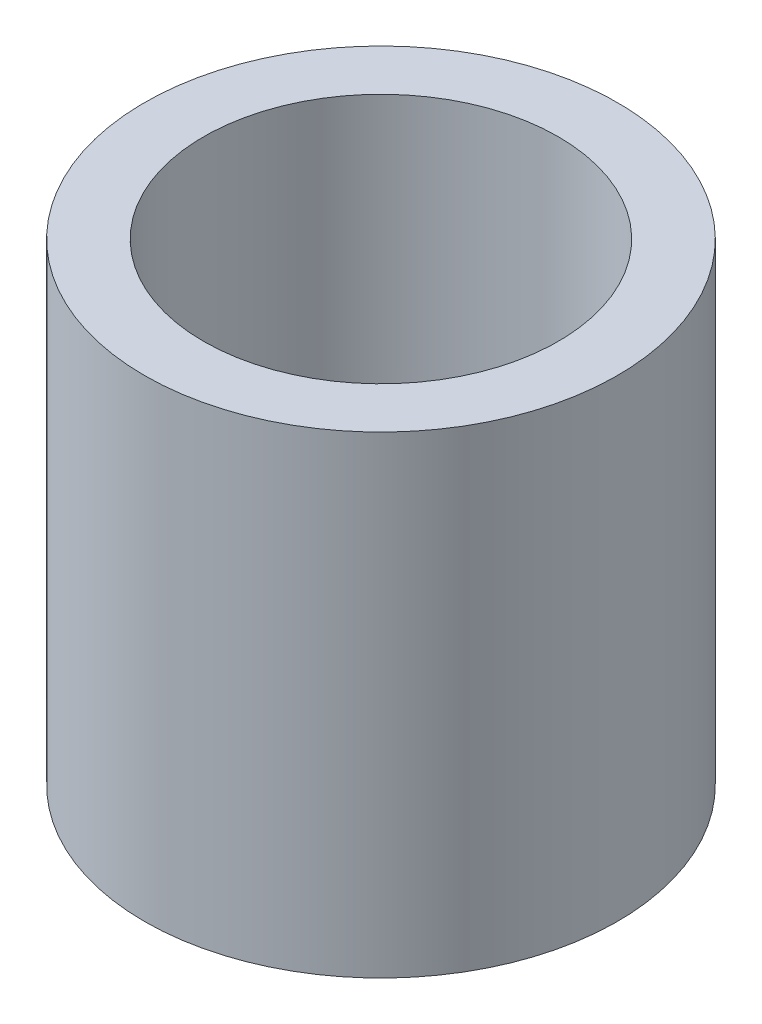
ISO-10303-21;
HEADER;
FILE_DESCRIPTION(('STEP AP214'),'2;1');
FILE_NAME('part.step','',(''),(''),'','','');
FILE_SCHEMA(('AUTOMOTIVE_DESIGN { 1 0 10303 214 1 1 1 1 }'));
ENDSEC;
DATA;
#1=APPLICATION_CONTEXT('core data for automotive mechanical design processes');
#2=APPLICATION_PROTOCOL_DEFINITION('international standard','automotive_design',2000,#1);
#3=PRODUCT_CONTEXT('',#1,'mechanical');
#4=PRODUCT('Part','Part','',(#3));
#5=PRODUCT_RELATED_PRODUCT_CATEGORY('part','',(#4));
#6=PRODUCT_DEFINITION_FORMATION('','',#4);
#7=PRODUCT_DEFINITION_CONTEXT('part definition',#1,'design');
#8=PRODUCT_DEFINITION('design','',#6,#7);
#9=PRODUCT_DEFINITION_SHAPE('','',#8);
#10=(LENGTH_UNIT() NAMED_UNIT(*) SI_UNIT(.MILLI.,.METRE.));
#11=(NAMED_UNIT(*) PLANE_ANGLE_UNIT() SI_UNIT($,.RADIAN.));
#12=(NAMED_UNIT(*) SI_UNIT($,.STERADIAN.) SOLID_ANGLE_UNIT());
#13=UNCERTAINTY_MEASURE_WITH_UNIT(LENGTH_MEASURE(1.E-05),#10,'distance_accuracy_value','');
#14=(GEOMETRIC_REPRESENTATION_CONTEXT(3) GLOBAL_UNCERTAINTY_ASSIGNED_CONTEXT((#13)) GLOBAL_UNIT_ASSIGNED_CONTEXT((#10,
#11,#12)) REPRESENTATION_CONTEXT('',''));
#15=CARTESIAN_POINT('',(0.,0.,0.));
#16=DIRECTION('',(0.,0.,1.));
#17=DIRECTION('',(1.,0.,0.));
#18=AXIS2_PLACEMENT_3D('',#15,#16,#17);
#19=CARTESIAN_POINT('',(0.,12.7,0.));
#20=DIRECTION('',(0.,-1.,0.));
#21=DIRECTION('',(0.,0.,-1.));
#22=AXIS2_PLACEMENT_3D('',#19,#20,#21);
#23=CYLINDRICAL_SURFACE('',#22,6.35);
#24=CARTESIAN_POINT('',(0.,12.7,0.));
#25=DIRECTION('',(0.,1.,0.));
#26=DIRECTION('',(0.,0.,1.));
#27=AXIS2_PLACEMENT_3D('',#24,#25,#26);
#28=CIRCLE('',#27,6.35);
#29=CARTESIAN_POINT('',(0.,12.7,6.35));
#30=VERTEX_POINT('',#29);
#31=EDGE_CURVE('E10',#30,#30,#28,.T.);
#32=ORIENTED_EDGE('',*,*,#31,.F.);
#33=EDGE_LOOP('',(#32));
#34=FACE_BOUND('',#33,.T.);
#35=CARTESIAN_POINT('',(0.,0.,0.));
#36=DIRECTION('',(0.,1.,0.));
#37=DIRECTION('',(0.,0.,1.));
#38=AXIS2_PLACEMENT_3D('',#35,#36,#37);
#39=CIRCLE('',#38,6.35);
#40=CARTESIAN_POINT('',(0.,0.,6.35));
#41=VERTEX_POINT('',#40);
#42=EDGE_CURVE('E36',#41,#41,#39,.T.);
#43=ORIENTED_EDGE('',*,*,#42,.T.);
#44=EDGE_LOOP('',(#43));
#45=FACE_BOUND('',#44,.T.);
#46=ADVANCED_FACE('F33',(#34,#45),#23,.T.);
#47=CARTESIAN_POINT('',(0.,12.7,0.));
#48=DIRECTION('',(0.,1.,0.));
#49=DIRECTION('',(0.,0.,1.));
#50=AXIS2_PLACEMENT_3D('',#47,#48,#49);
#51=PLANE('',#50);
#52=CARTESIAN_POINT('',(0.,12.7,0.));
#53=DIRECTION('',(0.,1.,0.));
#54=DIRECTION('',(0.,0.,1.));
#55=AXIS2_PLACEMENT_3D('',#52,#53,#54);
#56=CIRCLE('',#55,4.7625);
#57=CARTESIAN_POINT('',(0.,12.7,4.7625));
#58=VERTEX_POINT('',#57);
#59=EDGE_CURVE('E45',#58,#58,#56,.T.);
#60=ORIENTED_EDGE('',*,*,#59,.F.);
#61=EDGE_LOOP('',(#60));
#62=FACE_BOUND('',#61,.T.);
#63=ORIENTED_EDGE('',*,*,#31,.T.);
#64=EDGE_LOOP('',(#63));
#65=FACE_BOUND('',#64,.T.);
#66=ADVANCED_FACE('F60',(#62,#65),#51,.T.);
#67=CARTESIAN_POINT('',(0.,0.,0.));
#68=DIRECTION('',(0.,1.,0.));
#69=DIRECTION('',(0.,0.,1.));
#70=AXIS2_PLACEMENT_3D('',#67,#68,#69);
#71=PLANE('',#70);
#72=CARTESIAN_POINT('',(0.,0.,0.));
#73=DIRECTION('',(0.,1.,0.));
#74=DIRECTION('',(0.,0.,1.));
#75=AXIS2_PLACEMENT_3D('',#72,#73,#74);
#76=CIRCLE('',#75,4.7625);
#77=CARTESIAN_POINT('',(0.,0.,4.7625));
#78=VERTEX_POINT('',#77);
#79=EDGE_CURVE('E43',#78,#78,#76,.T.);
#80=ORIENTED_EDGE('',*,*,#79,.T.);
#81=EDGE_LOOP('',(#80));
#82=FACE_BOUND('',#81,.T.);
#83=ORIENTED_EDGE('',*,*,#42,.F.);
#84=EDGE_LOOP('',(#83));
#85=FACE_BOUND('',#84,.T.);
#86=ADVANCED_FACE('F51',(#82,#85),#71,.F.);
#87=CARTESIAN_POINT('',(0.,0.,0.));
#88=DIRECTION('',(0.,1.,0.));
#89=DIRECTION('',(0.,0.,1.));
#90=AXIS2_PLACEMENT_3D('',#87,#88,#89);
#91=CYLINDRICAL_SURFACE('',#90,4.7625);
#92=ORIENTED_EDGE('',*,*,#79,.F.);
#93=EDGE_LOOP('',(#92));
#94=FACE_BOUND('',#93,.T.);
#95=ORIENTED_EDGE('',*,*,#59,.T.);
#96=EDGE_LOOP('',(#95));
#97=FACE_BOUND('',#96,.T.);
#98=ADVANCED_FACE('F54',(#94,#97),#91,.F.);
#99=CLOSED_SHELL('',(#46,#66,#86,#98));
#100=MANIFOLD_SOLID_BREP('B2',#99);
#101=ADVANCED_BREP_SHAPE_REPRESENTATION('',(#18,#100),#14);
#102=SHAPE_DEFINITION_REPRESENTATION(#9,#101);
ENDSEC;
END-ISO-10303-21;
